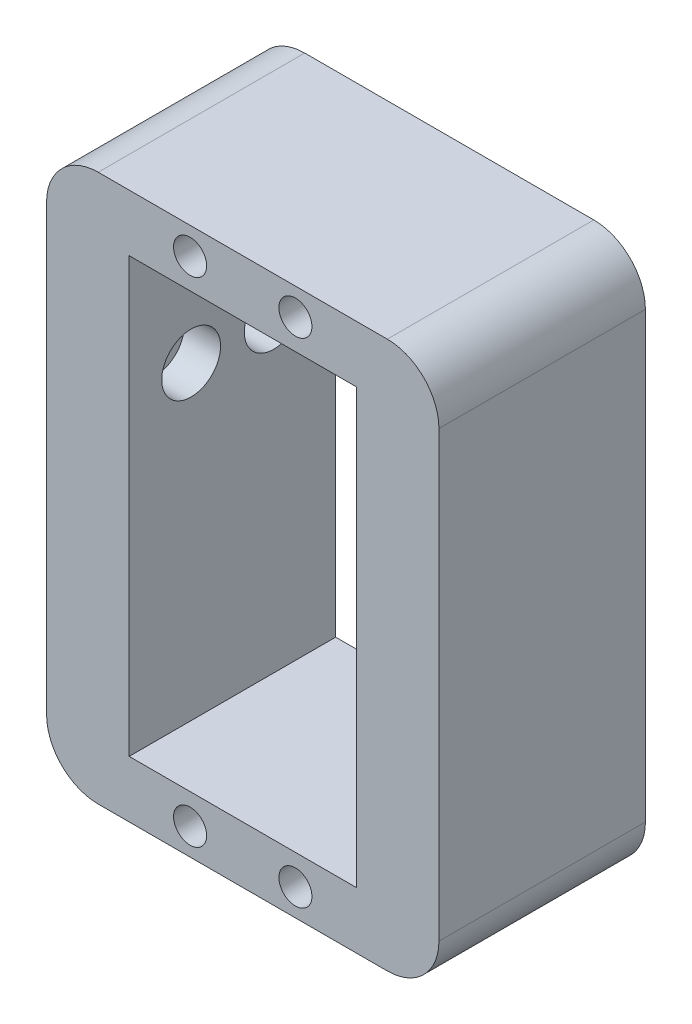
ISO-10303-21;
HEADER;
FILE_DESCRIPTION(('STEP AP214'),'2;1');
FILE_NAME('part.step','',(''),(''),'','','');
FILE_SCHEMA(('AUTOMOTIVE_DESIGN { 1 0 10303 214 1 1 1 1 }'));
ENDSEC;
DATA;
#1=APPLICATION_CONTEXT('core data for automotive mechanical design processes');
#2=APPLICATION_PROTOCOL_DEFINITION('international standard','automotive_design',2000,#1);
#3=PRODUCT_CONTEXT('',#1,'mechanical');
#4=PRODUCT('Part','Part','',(#3));
#5=PRODUCT_RELATED_PRODUCT_CATEGORY('part','',(#4));
#6=PRODUCT_DEFINITION_FORMATION('','',#4);
#7=PRODUCT_DEFINITION_CONTEXT('part definition',#1,'design');
#8=PRODUCT_DEFINITION('design','',#6,#7);
#9=PRODUCT_DEFINITION_SHAPE('','',#8);
#10=(LENGTH_UNIT() NAMED_UNIT(*) SI_UNIT(.MILLI.,.METRE.));
#11=(NAMED_UNIT(*) PLANE_ANGLE_UNIT() SI_UNIT($,.RADIAN.));
#12=(NAMED_UNIT(*) SI_UNIT($,.STERADIAN.) SOLID_ANGLE_UNIT());
#13=UNCERTAINTY_MEASURE_WITH_UNIT(LENGTH_MEASURE(1.E-05),#10,'distance_accuracy_value','');
#14=(GEOMETRIC_REPRESENTATION_CONTEXT(3) GLOBAL_UNCERTAINTY_ASSIGNED_CONTEXT((#13)) GLOBAL_UNIT_ASSIGNED_CONTEXT((#10,
#11,#12)) REPRESENTATION_CONTEXT('',''));
#15=CARTESIAN_POINT('',(0.,0.,0.));
#16=DIRECTION('',(0.,0.,1.));
#17=DIRECTION('',(1.,0.,0.));
#18=AXIS2_PLACEMENT_3D('',#15,#16,#17);
#19=CARTESIAN_POINT('',(-19.,9.00000000000001,6.));
#20=DIRECTION('',(1.,0.,0.));
#21=DIRECTION('',(0.,0.,-1.));
#22=AXIS2_PLACEMENT_3D('',#19,#20,#21);
#23=CYLINDRICAL_SURFACE('',#22,1.75);
#24=CARTESIAN_POINT('',(-19.,9.00000000000001,6.));
#25=DIRECTION('',(1.,0.,0.));
#26=DIRECTION('',(0.,0.,-1.));
#27=AXIS2_PLACEMENT_3D('',#24,#25,#26);
#28=CIRCLE('',#27,1.75);
#29=CARTESIAN_POINT('',(-19.,9.00000000000001,4.25));
#30=VERTEX_POINT('',#29);
#31=EDGE_CURVE('E421',#30,#30,#28,.T.);
#32=ORIENTED_EDGE('',*,*,#31,.F.);
#33=EDGE_LOOP('',(#32));
#34=FACE_BOUND('',#33,.T.);
#35=CARTESIAN_POINT('',(-14.5,9.00000000000001,6.));
#36=DIRECTION('',(1.,0.,0.));
#37=DIRECTION('',(0.,0.,-1.));
#38=AXIS2_PLACEMENT_3D('',#35,#36,#37);
#39=CIRCLE('',#38,1.75);
#40=CARTESIAN_POINT('',(-14.5,9.00000000000001,4.25));
#41=VERTEX_POINT('',#40);
#42=EDGE_CURVE('E402',#41,#41,#39,.T.);
#43=ORIENTED_EDGE('',*,*,#42,.T.);
#44=EDGE_LOOP('',(#43));
#45=FACE_BOUND('',#44,.T.);
#46=ADVANCED_FACE('F37',(#34,#45),#23,.F.);
#47=CARTESIAN_POINT('',(-19.,9.00000000000001,14.));
#48=DIRECTION('',(1.,0.,0.));
#49=DIRECTION('',(0.,0.,-1.));
#50=AXIS2_PLACEMENT_3D('',#47,#48,#49);
#51=CYLINDRICAL_SURFACE('',#50,1.75);
#52=CARTESIAN_POINT('',(-19.,9.00000000000001,14.));
#53=DIRECTION('',(1.,0.,0.));
#54=DIRECTION('',(0.,0.,-1.));
#55=AXIS2_PLACEMENT_3D('',#52,#53,#54);
#56=CIRCLE('',#55,1.75);
#57=CARTESIAN_POINT('',(-19.,9.00000000000001,12.25));
#58=VERTEX_POINT('',#57);
#59=EDGE_CURVE('E417',#58,#58,#56,.T.);
#60=ORIENTED_EDGE('',*,*,#59,.F.);
#61=EDGE_LOOP('',(#60));
#62=FACE_BOUND('',#61,.T.);
#63=CARTESIAN_POINT('',(-14.5,9.00000000000001,14.));
#64=DIRECTION('',(1.,0.,0.));
#65=DIRECTION('',(0.,0.,-1.));
#66=AXIS2_PLACEMENT_3D('',#63,#64,#65);
#67=CIRCLE('',#66,1.75);
#68=CARTESIAN_POINT('',(-14.5,9.00000000000001,12.25));
#69=VERTEX_POINT('',#68);
#70=EDGE_CURVE('E406',#69,#69,#67,.T.);
#71=ORIENTED_EDGE('',*,*,#70,.T.);
#72=EDGE_LOOP('',(#71));
#73=FACE_BOUND('',#72,.T.);
#74=ADVANCED_FACE('F265',(#62,#73),#51,.F.);
#75=CARTESIAN_POINT('',(0.,0.,20.));
#76=DIRECTION('',(0.,0.,1.));
#77=DIRECTION('',(1.,0.,0.));
#78=AXIS2_PLACEMENT_3D('',#75,#76,#77);
#79=PLANE('',#78);
#80=CARTESIAN_POINT('',(-5.1,-23.8999999999999,20.));
#81=DIRECTION('',(0.,0.,-1.));
#82=DIRECTION('',(-1.,0.,0.));
#83=AXIS2_PLACEMENT_3D('',#80,#81,#82);
#84=CIRCLE('',#83,1.6);
#85=CARTESIAN_POINT('',(-6.7,-23.8999999999999,20.));
#86=VERTEX_POINT('',#85);
#87=EDGE_CURVE('E431',#86,#86,#84,.T.);
#88=ORIENTED_EDGE('',*,*,#87,.T.);
#89=EDGE_LOOP('',(#88));
#90=FACE_BOUND('',#89,.T.);
#91=CARTESIAN_POINT('',(5.1,23.9000000000001,20.));
#92=DIRECTION('',(0.,0.,-1.));
#93=DIRECTION('',(-1.,0.,0.));
#94=AXIS2_PLACEMENT_3D('',#91,#92,#93);
#95=CIRCLE('',#94,1.6);
#96=CARTESIAN_POINT('',(3.5,23.9000000000001,20.));
#97=VERTEX_POINT('',#96);
#98=EDGE_CURVE('E438',#97,#97,#95,.T.);
#99=ORIENTED_EDGE('',*,*,#98,.T.);
#100=EDGE_LOOP('',(#99));
#101=FACE_BOUND('',#100,.T.);
#102=CARTESIAN_POINT('',(-5.1,23.9000000000001,20.));
#103=DIRECTION('',(0.,0.,-1.));
#104=DIRECTION('',(-1.,0.,0.));
#105=AXIS2_PLACEMENT_3D('',#102,#103,#104);
#106=CIRCLE('',#105,1.6);
#107=CARTESIAN_POINT('',(-6.7,23.9000000000001,20.));
#108=VERTEX_POINT('',#107);
#109=EDGE_CURVE('E425',#108,#108,#106,.T.);
#110=ORIENTED_EDGE('',*,*,#109,.T.);
#111=EDGE_LOOP('',(#110));
#112=FACE_BOUND('',#111,.T.);
#113=CARTESIAN_POINT('',(5.1,-23.8999999999999,20.));
#114=DIRECTION('',(0.,0.,-1.));
#115=DIRECTION('',(-1.,0.,0.));
#116=AXIS2_PLACEMENT_3D('',#113,#114,#115);
#117=CIRCLE('',#116,1.6);
#118=CARTESIAN_POINT('',(3.5,-23.8999999999999,20.));
#119=VERTEX_POINT('',#118);
#120=EDGE_CURVE('E160',#119,#119,#117,.T.);
#121=ORIENTED_EDGE('',*,*,#120,.T.);
#122=EDGE_LOOP('',(#121));
#123=FACE_BOUND('',#122,.T.);
#124=DIRECTION('',(0.,-1.,0.));
#125=VECTOR('',#124,1.);
#126=CARTESIAN_POINT('',(-19.,26.5,20.));
#127=LINE('',#126,#125);
#128=CARTESIAN_POINT('',(-19.,21.5,20.));
#129=VERTEX_POINT('',#128);
#130=CARTESIAN_POINT('',(-19.,-21.5,20.));
#131=VERTEX_POINT('',#130);
#132=EDGE_CURVE('E176',#129,#131,#127,.T.);
#133=ORIENTED_EDGE('',*,*,#132,.T.);
#134=CARTESIAN_POINT('',(-14.,-21.5,20.));
#135=DIRECTION('',(0.,0.,1.));
#136=DIRECTION('',(1.,0.,0.));
#137=AXIS2_PLACEMENT_3D('',#134,#135,#136);
#138=CIRCLE('',#137,5.);
#139=CARTESIAN_POINT('',(-14.,-26.5,20.));
#140=VERTEX_POINT('',#139);
#141=EDGE_CURVE('E214',#131,#140,#138,.T.);
#142=ORIENTED_EDGE('',*,*,#141,.T.);
#143=DIRECTION('',(1.,0.,0.));
#144=VECTOR('',#143,1.);
#145=CARTESIAN_POINT('',(-19.,-26.5,20.));
#146=LINE('',#145,#144);
#147=CARTESIAN_POINT('',(14.,-26.5,20.));
#148=VERTEX_POINT('',#147);
#149=EDGE_CURVE('E179',#140,#148,#146,.T.);
#150=ORIENTED_EDGE('',*,*,#149,.T.);
#151=CARTESIAN_POINT('',(14.,-21.5,20.));
#152=DIRECTION('',(0.,0.,1.));
#153=DIRECTION('',(1.,0.,0.));
#154=AXIS2_PLACEMENT_3D('',#151,#152,#153);
#155=CIRCLE('',#154,5.);
#156=CARTESIAN_POINT('',(19.,-21.5,20.));
#157=VERTEX_POINT('',#156);
#158=EDGE_CURVE('E212',#148,#157,#155,.T.);
#159=ORIENTED_EDGE('',*,*,#158,.T.);
#160=DIRECTION('',(0.,1.,0.));
#161=VECTOR('',#160,1.);
#162=CARTESIAN_POINT('',(19.,26.5,20.));
#163=LINE('',#162,#161);
#164=CARTESIAN_POINT('',(19.,21.5,20.));
#165=VERTEX_POINT('',#164);
#166=EDGE_CURVE('E171',#157,#165,#163,.T.);
#167=ORIENTED_EDGE('',*,*,#166,.T.);
#168=CARTESIAN_POINT('',(14.,21.5,20.));
#169=DIRECTION('',(0.,0.,1.));
#170=DIRECTION('',(1.,0.,0.));
#171=AXIS2_PLACEMENT_3D('',#168,#169,#170);
#172=CIRCLE('',#171,5.);
#173=CARTESIAN_POINT('',(14.,26.5,20.));
#174=VERTEX_POINT('',#173);
#175=EDGE_CURVE('E57',#165,#174,#172,.T.);
#176=ORIENTED_EDGE('',*,*,#175,.T.);
#177=DIRECTION('',(-1.,0.,0.));
#178=VECTOR('',#177,1.);
#179=CARTESIAN_POINT('',(-19.,26.5,20.));
#180=LINE('',#179,#178);
#181=CARTESIAN_POINT('',(-14.,26.5,20.));
#182=VERTEX_POINT('',#181);
#183=EDGE_CURVE('E173',#174,#182,#180,.T.);
#184=ORIENTED_EDGE('',*,*,#183,.T.);
#185=CARTESIAN_POINT('',(-14.,21.5,20.));
#186=DIRECTION('',(0.,0.,1.));
#187=DIRECTION('',(1.,0.,0.));
#188=AXIS2_PLACEMENT_3D('',#185,#186,#187);
#189=CIRCLE('',#188,5.);
#190=EDGE_CURVE('E210',#182,#129,#189,.T.);
#191=ORIENTED_EDGE('',*,*,#190,.T.);
#192=EDGE_LOOP('',(#133,#142,#150,#159,#167,#176,#184,#191));
#193=FACE_BOUND('',#192,.T.);
#194=DIRECTION('',(-1.,0.,0.));
#195=VECTOR('',#194,1.);
#196=CARTESIAN_POINT('',(-11.,21.,20.));
#197=LINE('',#196,#195);
#198=CARTESIAN_POINT('',(11.,21.,20.));
#199=VERTEX_POINT('',#198);
#200=CARTESIAN_POINT('',(-11.,21.,20.));
#201=VERTEX_POINT('',#200);
#202=EDGE_CURVE('E137',#199,#201,#197,.T.);
#203=ORIENTED_EDGE('',*,*,#202,.F.);
#204=DIRECTION('',(0.,1.,0.));
#205=VECTOR('',#204,1.);
#206=CARTESIAN_POINT('',(11.,21.,20.));
#207=LINE('',#206,#205);
#208=CARTESIAN_POINT('',(11.,-21.,20.));
#209=VERTEX_POINT('',#208);
#210=EDGE_CURVE('E127',#209,#199,#207,.T.);
#211=ORIENTED_EDGE('',*,*,#210,.F.);
#212=DIRECTION('',(1.,0.,0.));
#213=VECTOR('',#212,1.);
#214=CARTESIAN_POINT('',(-11.,-21.,20.));
#215=LINE('',#214,#213);
#216=CARTESIAN_POINT('',(-11.,-21.,20.));
#217=VERTEX_POINT('',#216);
#218=EDGE_CURVE('E153',#217,#209,#215,.T.);
#219=ORIENTED_EDGE('',*,*,#218,.F.);
#220=DIRECTION('',(0.,-1.,0.));
#221=VECTOR('',#220,1.);
#222=CARTESIAN_POINT('',(-11.,21.,20.));
#223=LINE('',#222,#221);
#224=EDGE_CURVE('E151',#201,#217,#223,.T.);
#225=ORIENTED_EDGE('',*,*,#224,.F.);
#226=EDGE_LOOP('',(#203,#211,#219,#225));
#227=FACE_BOUND('',#226,.T.);
#228=ADVANCED_FACE('F149',(#90,#101,#112,#123,#193,#227),#79,.T.);
#229=CARTESIAN_POINT('',(0.,0.,0.));
#230=DIRECTION('',(0.,0.,1.));
#231=DIRECTION('',(1.,0.,0.));
#232=AXIS2_PLACEMENT_3D('',#229,#230,#231);
#233=PLANE('',#232);
#234=CARTESIAN_POINT('',(-5.1,-23.8999999999999,0.));
#235=DIRECTION('',(0.,0.,-1.));
#236=DIRECTION('',(-1.,0.,0.));
#237=AXIS2_PLACEMENT_3D('',#234,#235,#236);
#238=CIRCLE('',#237,1.6);
#239=CARTESIAN_POINT('',(-6.7,-23.8999999999999,0.));
#240=VERTEX_POINT('',#239);
#241=EDGE_CURVE('E435',#240,#240,#238,.T.);
#242=ORIENTED_EDGE('',*,*,#241,.F.);
#243=EDGE_LOOP('',(#242));
#244=FACE_BOUND('',#243,.T.);
#245=CARTESIAN_POINT('',(5.1,23.9000000000001,0.));
#246=DIRECTION('',(0.,0.,-1.));
#247=DIRECTION('',(-1.,0.,0.));
#248=AXIS2_PLACEMENT_3D('',#245,#246,#247);
#249=CIRCLE('',#248,1.6);
#250=CARTESIAN_POINT('',(3.5,23.9000000000001,0.));
#251=VERTEX_POINT('',#250);
#252=EDGE_CURVE('E428',#251,#251,#249,.T.);
#253=ORIENTED_EDGE('',*,*,#252,.F.);
#254=EDGE_LOOP('',(#253));
#255=FACE_BOUND('',#254,.T.);
#256=CARTESIAN_POINT('',(-5.1,23.9000000000001,0.));
#257=DIRECTION('',(0.,0.,-1.));
#258=DIRECTION('',(-1.,0.,0.));
#259=AXIS2_PLACEMENT_3D('',#256,#257,#258);
#260=CIRCLE('',#259,1.6);
#261=CARTESIAN_POINT('',(-6.7,23.9000000000001,0.));
#262=VERTEX_POINT('',#261);
#263=EDGE_CURVE('E420',#262,#262,#260,.T.);
#264=ORIENTED_EDGE('',*,*,#263,.F.);
#265=EDGE_LOOP('',(#264));
#266=FACE_BOUND('',#265,.T.);
#267=CARTESIAN_POINT('',(5.1,-23.8999999999999,0.));
#268=DIRECTION('',(0.,0.,-1.));
#269=DIRECTION('',(-1.,0.,0.));
#270=AXIS2_PLACEMENT_3D('',#267,#268,#269);
#271=CIRCLE('',#270,1.6);
#272=CARTESIAN_POINT('',(3.5,-23.8999999999999,0.));
#273=VERTEX_POINT('',#272);
#274=EDGE_CURVE('E434',#273,#273,#271,.T.);
#275=ORIENTED_EDGE('',*,*,#274,.F.);
#276=EDGE_LOOP('',(#275));
#277=FACE_BOUND('',#276,.T.);
#278=DIRECTION('',(1.,0.,0.));
#279=VECTOR('',#278,1.);
#280=CARTESIAN_POINT('',(-19.,-26.5,0.));
#281=LINE('',#280,#279);
#282=CARTESIAN_POINT('',(-14.,-26.5,0.));
#283=VERTEX_POINT('',#282);
#284=CARTESIAN_POINT('',(14.,-26.5,0.));
#285=VERTEX_POINT('',#284);
#286=EDGE_CURVE('E174',#283,#285,#281,.T.);
#287=ORIENTED_EDGE('',*,*,#286,.F.);
#288=CARTESIAN_POINT('',(-14.,-21.5,0.));
#289=DIRECTION('',(0.,0.,1.));
#290=DIRECTION('',(1.,0.,0.));
#291=AXIS2_PLACEMENT_3D('',#288,#289,#290);
#292=CIRCLE('',#291,5.);
#293=CARTESIAN_POINT('',(-19.,-21.5,0.));
#294=VERTEX_POINT('',#293);
#295=EDGE_CURVE('E202',#283,#294,#292,.F.);
#296=ORIENTED_EDGE('',*,*,#295,.T.);
#297=DIRECTION('',(0.,-1.,0.));
#298=VECTOR('',#297,1.);
#299=CARTESIAN_POINT('',(-19.,26.5,0.));
#300=LINE('',#299,#298);
#301=CARTESIAN_POINT('',(-19.,21.5,0.));
#302=VERTEX_POINT('',#301);
#303=EDGE_CURVE('E187',#302,#294,#300,.T.);
#304=ORIENTED_EDGE('',*,*,#303,.F.);
#305=CARTESIAN_POINT('',(-14.,21.5,0.));
#306=DIRECTION('',(0.,0.,1.));
#307=DIRECTION('',(1.,0.,0.));
#308=AXIS2_PLACEMENT_3D('',#305,#306,#307);
#309=CIRCLE('',#308,5.);
#310=CARTESIAN_POINT('',(-14.,26.5,0.));
#311=VERTEX_POINT('',#310);
#312=EDGE_CURVE('E198',#302,#311,#309,.F.);
#313=ORIENTED_EDGE('',*,*,#312,.T.);
#314=DIRECTION('',(-1.,0.,0.));
#315=VECTOR('',#314,1.);
#316=CARTESIAN_POINT('',(-19.,26.5,0.));
#317=LINE('',#316,#315);
#318=CARTESIAN_POINT('',(14.,26.5,0.));
#319=VERTEX_POINT('',#318);
#320=EDGE_CURVE('E185',#319,#311,#317,.T.);
#321=ORIENTED_EDGE('',*,*,#320,.F.);
#322=CARTESIAN_POINT('',(14.,21.5,0.));
#323=DIRECTION('',(0.,0.,1.));
#324=DIRECTION('',(1.,0.,0.));
#325=AXIS2_PLACEMENT_3D('',#322,#323,#324);
#326=CIRCLE('',#325,5.);
#327=CARTESIAN_POINT('',(19.,21.5,0.));
#328=VERTEX_POINT('',#327);
#329=EDGE_CURVE('E196',#319,#328,#326,.F.);
#330=ORIENTED_EDGE('',*,*,#329,.T.);
#331=DIRECTION('',(0.,1.,0.));
#332=VECTOR('',#331,1.);
#333=CARTESIAN_POINT('',(19.,26.5,0.));
#334=LINE('',#333,#332);
#335=CARTESIAN_POINT('',(19.,-21.5,0.));
#336=VERTEX_POINT('',#335);
#337=EDGE_CURVE('E145',#336,#328,#334,.T.);
#338=ORIENTED_EDGE('',*,*,#337,.F.);
#339=CARTESIAN_POINT('',(14.,-21.5,0.));
#340=DIRECTION('',(0.,0.,1.));
#341=DIRECTION('',(1.,0.,0.));
#342=AXIS2_PLACEMENT_3D('',#339,#340,#341);
#343=CIRCLE('',#342,5.);
#344=EDGE_CURVE('E200',#336,#285,#343,.F.);
#345=ORIENTED_EDGE('',*,*,#344,.T.);
#346=EDGE_LOOP('',(#287,#296,#304,#313,#321,#330,#338,#345));
#347=FACE_BOUND('',#346,.T.);
#348=DIRECTION('',(0.,1.,0.));
#349=VECTOR('',#348,1.);
#350=CARTESIAN_POINT('',(11.,21.,0.));
#351=LINE('',#350,#349);
#352=CARTESIAN_POINT('',(11.,-21.,0.));
#353=VERTEX_POINT('',#352);
#354=CARTESIAN_POINT('',(11.,21.,0.));
#355=VERTEX_POINT('',#354);
#356=EDGE_CURVE('E158',#353,#355,#351,.T.);
#357=ORIENTED_EDGE('',*,*,#356,.T.);
#358=DIRECTION('',(-1.,0.,0.));
#359=VECTOR('',#358,1.);
#360=CARTESIAN_POINT('',(-11.,21.,0.));
#361=LINE('',#360,#359);
#362=CARTESIAN_POINT('',(-11.,21.,0.));
#363=VERTEX_POINT('',#362);
#364=EDGE_CURVE('E144',#355,#363,#361,.T.);
#365=ORIENTED_EDGE('',*,*,#364,.T.);
#366=DIRECTION('',(0.,-1.,0.));
#367=VECTOR('',#366,1.);
#368=CARTESIAN_POINT('',(-11.,21.,0.));
#369=LINE('',#368,#367);
#370=CARTESIAN_POINT('',(-11.,-21.,0.));
#371=VERTEX_POINT('',#370);
#372=EDGE_CURVE('E162',#363,#371,#369,.T.);
#373=ORIENTED_EDGE('',*,*,#372,.T.);
#374=DIRECTION('',(1.,0.,0.));
#375=VECTOR('',#374,1.);
#376=CARTESIAN_POINT('',(-11.,-21.,0.));
#377=LINE('',#376,#375);
#378=EDGE_CURVE('E138',#371,#353,#377,.T.);
#379=ORIENTED_EDGE('',*,*,#378,.T.);
#380=EDGE_LOOP('',(#357,#365,#373,#379));
#381=FACE_BOUND('',#380,.T.);
#382=ADVANCED_FACE('F227',(#244,#255,#266,#277,#347,#381),#233,.F.);
#383=CARTESIAN_POINT('',(19.,26.5,20.));
#384=DIRECTION('',(-1.,0.,0.));
#385=DIRECTION('',(0.,0.,1.));
#386=AXIS2_PLACEMENT_3D('',#383,#384,#385);
#387=PLANE('',#386);
#388=ORIENTED_EDGE('',*,*,#166,.F.);
#389=DIRECTION('',(0.,0.,-1.));
#390=VECTOR('',#389,1.);
#391=CARTESIAN_POINT('',(19.,-21.5,20.));
#392=LINE('',#391,#390);
#393=EDGE_CURVE('E218',#157,#336,#392,.T.);
#394=ORIENTED_EDGE('',*,*,#393,.T.);
#395=ORIENTED_EDGE('',*,*,#337,.T.);
#396=DIRECTION('',(0.,0.,-1.));
#397=VECTOR('',#396,1.);
#398=CARTESIAN_POINT('',(19.,21.5,20.));
#399=LINE('',#398,#397);
#400=EDGE_CURVE('E216',#328,#165,#399,.F.);
#401=ORIENTED_EDGE('',*,*,#400,.T.);
#402=EDGE_LOOP('',(#388,#394,#395,#401));
#403=FACE_BOUND('',#402,.T.);
#404=ADVANCED_FACE('F253',(#403),#387,.F.);
#405=CARTESIAN_POINT('',(-19.,26.5,20.));
#406=DIRECTION('',(0.,-1.,0.));
#407=DIRECTION('',(0.,0.,-1.));
#408=AXIS2_PLACEMENT_3D('',#405,#406,#407);
#409=PLANE('',#408);
#410=ORIENTED_EDGE('',*,*,#320,.T.);
#411=DIRECTION('',(0.,0.,-1.));
#412=VECTOR('',#411,1.);
#413=CARTESIAN_POINT('',(-14.,26.5,20.));
#414=LINE('',#413,#412);
#415=EDGE_CURVE('E11',#311,#182,#414,.F.);
#416=ORIENTED_EDGE('',*,*,#415,.T.);
#417=ORIENTED_EDGE('',*,*,#183,.F.);
#418=DIRECTION('',(0.,0.,-1.));
#419=VECTOR('',#418,1.);
#420=CARTESIAN_POINT('',(14.,26.5,20.));
#421=LINE('',#420,#419);
#422=EDGE_CURVE('E45',#174,#319,#421,.T.);
#423=ORIENTED_EDGE('',*,*,#422,.T.);
#424=EDGE_LOOP('',(#410,#416,#417,#423));
#425=FACE_BOUND('',#424,.T.);
#426=ADVANCED_FACE('F223',(#425),#409,.F.);
#427=CARTESIAN_POINT('',(-19.,26.5,20.));
#428=DIRECTION('',(1.,0.,0.));
#429=DIRECTION('',(0.,0.,-1.));
#430=AXIS2_PLACEMENT_3D('',#427,#428,#429);
#431=PLANE('',#430);
#432=ORIENTED_EDGE('',*,*,#59,.T.);
#433=EDGE_LOOP('',(#432));
#434=FACE_BOUND('',#433,.T.);
#435=ORIENTED_EDGE('',*,*,#31,.T.);
#436=EDGE_LOOP('',(#435));
#437=FACE_BOUND('',#436,.T.);
#438=ORIENTED_EDGE('',*,*,#303,.T.);
#439=DIRECTION('',(0.,0.,-1.));
#440=VECTOR('',#439,1.);
#441=CARTESIAN_POINT('',(-19.,-21.5,20.));
#442=LINE('',#441,#440);
#443=EDGE_CURVE('E207',#294,#131,#442,.F.);
#444=ORIENTED_EDGE('',*,*,#443,.T.);
#445=ORIENTED_EDGE('',*,*,#132,.F.);
#446=DIRECTION('',(0.,0.,-1.));
#447=VECTOR('',#446,1.);
#448=CARTESIAN_POINT('',(-19.,21.5,20.));
#449=LINE('',#448,#447);
#450=EDGE_CURVE('E204',#129,#302,#449,.T.);
#451=ORIENTED_EDGE('',*,*,#450,.T.);
#452=EDGE_LOOP('',(#438,#444,#445,#451));
#453=FACE_BOUND('',#452,.T.);
#454=ADVANCED_FACE('F237',(#434,#437,#453),#431,.F.);
#455=CARTESIAN_POINT('',(-19.,-26.5,20.));
#456=DIRECTION('',(0.,1.,0.));
#457=DIRECTION('',(0.,0.,1.));
#458=AXIS2_PLACEMENT_3D('',#455,#456,#457);
#459=PLANE('',#458);
#460=ORIENTED_EDGE('',*,*,#149,.F.);
#461=DIRECTION('',(0.,0.,-1.));
#462=VECTOR('',#461,1.);
#463=CARTESIAN_POINT('',(-14.,-26.5,20.));
#464=LINE('',#463,#462);
#465=EDGE_CURVE('E193',#140,#283,#464,.T.);
#466=ORIENTED_EDGE('',*,*,#465,.T.);
#467=ORIENTED_EDGE('',*,*,#286,.T.);
#468=DIRECTION('',(0.,0.,-1.));
#469=VECTOR('',#468,1.);
#470=CARTESIAN_POINT('',(14.,-26.5,20.));
#471=LINE('',#470,#469);
#472=EDGE_CURVE('E182',#285,#148,#471,.F.);
#473=ORIENTED_EDGE('',*,*,#472,.T.);
#474=EDGE_LOOP('',(#460,#466,#467,#473));
#475=FACE_BOUND('',#474,.T.);
#476=ADVANCED_FACE('F245',(#475),#459,.F.);
#477=CARTESIAN_POINT('',(11.,21.,20.));
#478=DIRECTION('',(-1.,0.,0.));
#479=DIRECTION('',(0.,-1.,0.));
#480=AXIS2_PLACEMENT_3D('',#477,#478,#479);
#481=PLANE('',#480);
#482=ORIENTED_EDGE('',*,*,#356,.F.);
#483=DIRECTION('',(0.,0.,-1.));
#484=VECTOR('',#483,1.);
#485=CARTESIAN_POINT('',(11.,-21.,20.));
#486=LINE('',#485,#484);
#487=EDGE_CURVE('E133',#209,#353,#486,.T.);
#488=ORIENTED_EDGE('',*,*,#487,.F.);
#489=ORIENTED_EDGE('',*,*,#210,.T.);
#490=DIRECTION('',(0.,0.,-1.));
#491=VECTOR('',#490,1.);
#492=CARTESIAN_POINT('',(11.,21.,20.));
#493=LINE('',#492,#491);
#494=EDGE_CURVE('E130',#199,#355,#493,.T.);
#495=ORIENTED_EDGE('',*,*,#494,.T.);
#496=EDGE_LOOP('',(#482,#488,#489,#495));
#497=FACE_BOUND('',#496,.T.);
#498=ADVANCED_FACE('F129',(#497),#481,.T.);
#499=CARTESIAN_POINT('',(-11.,21.,20.));
#500=DIRECTION('',(0.,-1.,0.));
#501=DIRECTION('',(0.,0.,-1.));
#502=AXIS2_PLACEMENT_3D('',#499,#500,#501);
#503=PLANE('',#502);
#504=ORIENTED_EDGE('',*,*,#364,.F.);
#505=ORIENTED_EDGE('',*,*,#494,.F.);
#506=ORIENTED_EDGE('',*,*,#202,.T.);
#507=DIRECTION('',(0.,0.,-1.));
#508=VECTOR('',#507,1.);
#509=CARTESIAN_POINT('',(-11.,21.,20.));
#510=LINE('',#509,#508);
#511=EDGE_CURVE('E146',#201,#363,#510,.T.);
#512=ORIENTED_EDGE('',*,*,#511,.T.);
#513=EDGE_LOOP('',(#504,#505,#506,#512));
#514=FACE_BOUND('',#513,.T.);
#515=ADVANCED_FACE('F141',(#514),#503,.T.);
#516=CARTESIAN_POINT('',(-11.,21.,20.));
#517=DIRECTION('',(1.,0.,0.));
#518=DIRECTION('',(0.,0.,-1.));
#519=AXIS2_PLACEMENT_3D('',#516,#517,#518);
#520=PLANE('',#519);
#521=CARTESIAN_POINT('',(-11.,9.00000000000001,14.));
#522=DIRECTION('',(1.,0.,0.));
#523=DIRECTION('',(0.,0.,-1.));
#524=AXIS2_PLACEMENT_3D('',#521,#522,#523);
#525=CIRCLE('',#524,2.85);
#526=CARTESIAN_POINT('',(-11.,9.00000000000001,11.15));
#527=VERTEX_POINT('',#526);
#528=EDGE_CURVE('E410',#527,#527,#525,.T.);
#529=ORIENTED_EDGE('',*,*,#528,.F.);
#530=EDGE_LOOP('',(#529));
#531=FACE_BOUND('',#530,.T.);
#532=CARTESIAN_POINT('',(-11.,9.00000000000001,6.));
#533=DIRECTION('',(1.,0.,0.));
#534=DIRECTION('',(0.,0.,-1.));
#535=AXIS2_PLACEMENT_3D('',#532,#533,#534);
#536=CIRCLE('',#535,2.85);
#537=CARTESIAN_POINT('',(-11.,9.00000000000001,3.15));
#538=VERTEX_POINT('',#537);
#539=EDGE_CURVE('E407',#538,#538,#536,.T.);
#540=ORIENTED_EDGE('',*,*,#539,.F.);
#541=EDGE_LOOP('',(#540));
#542=FACE_BOUND('',#541,.T.);
#543=ORIENTED_EDGE('',*,*,#372,.F.);
#544=ORIENTED_EDGE('',*,*,#511,.F.);
#545=ORIENTED_EDGE('',*,*,#224,.T.);
#546=DIRECTION('',(0.,0.,-1.));
#547=VECTOR('',#546,1.);
#548=CARTESIAN_POINT('',(-11.,-21.,20.));
#549=LINE('',#548,#547);
#550=EDGE_CURVE('E168',#217,#371,#549,.T.);
#551=ORIENTED_EDGE('',*,*,#550,.T.);
#552=EDGE_LOOP('',(#543,#544,#545,#551));
#553=FACE_BOUND('',#552,.T.);
#554=ADVANCED_FACE('F296',(#531,#542,#553),#520,.T.);
#555=CARTESIAN_POINT('',(-11.,-21.,20.));
#556=DIRECTION('',(0.,1.,0.));
#557=DIRECTION('',(0.,0.,1.));
#558=AXIS2_PLACEMENT_3D('',#555,#556,#557);
#559=PLANE('',#558);
#560=ORIENTED_EDGE('',*,*,#378,.F.);
#561=ORIENTED_EDGE('',*,*,#550,.F.);
#562=ORIENTED_EDGE('',*,*,#218,.T.);
#563=ORIENTED_EDGE('',*,*,#487,.T.);
#564=EDGE_LOOP('',(#560,#561,#562,#563));
#565=FACE_BOUND('',#564,.T.);
#566=ADVANCED_FACE('F292',(#565),#559,.T.);
#567=CARTESIAN_POINT('',(5.1,-23.8999999999999,20.));
#568=DIRECTION('',(0.,0.,-1.));
#569=DIRECTION('',(-1.,0.,0.));
#570=AXIS2_PLACEMENT_3D('',#567,#568,#569);
#571=CYLINDRICAL_SURFACE('',#570,1.6);
#572=ORIENTED_EDGE('',*,*,#120,.F.);
#573=EDGE_LOOP('',(#572));
#574=FACE_BOUND('',#573,.T.);
#575=ORIENTED_EDGE('',*,*,#274,.T.);
#576=EDGE_LOOP('',(#575));
#577=FACE_BOUND('',#576,.T.);
#578=ADVANCED_FACE('F281',(#574,#577),#571,.F.);
#579=CARTESIAN_POINT('',(-5.1,23.9000000000001,20.));
#580=DIRECTION('',(0.,0.,-1.));
#581=DIRECTION('',(-1.,0.,0.));
#582=AXIS2_PLACEMENT_3D('',#579,#580,#581);
#583=CYLINDRICAL_SURFACE('',#582,1.6);
#584=ORIENTED_EDGE('',*,*,#109,.F.);
#585=EDGE_LOOP('',(#584));
#586=FACE_BOUND('',#585,.T.);
#587=ORIENTED_EDGE('',*,*,#263,.T.);
#588=EDGE_LOOP('',(#587));
#589=FACE_BOUND('',#588,.T.);
#590=ADVANCED_FACE('F277',(#586,#589),#583,.F.);
#591=CARTESIAN_POINT('',(5.1,23.9000000000001,20.));
#592=DIRECTION('',(0.,0.,-1.));
#593=DIRECTION('',(-1.,0.,0.));
#594=AXIS2_PLACEMENT_3D('',#591,#592,#593);
#595=CYLINDRICAL_SURFACE('',#594,1.6);
#596=ORIENTED_EDGE('',*,*,#98,.F.);
#597=EDGE_LOOP('',(#596));
#598=FACE_BOUND('',#597,.T.);
#599=ORIENTED_EDGE('',*,*,#252,.T.);
#600=EDGE_LOOP('',(#599));
#601=FACE_BOUND('',#600,.T.);
#602=ADVANCED_FACE('F280',(#598,#601),#595,.F.);
#603=CARTESIAN_POINT('',(-5.1,-23.8999999999999,20.));
#604=DIRECTION('',(0.,0.,-1.));
#605=DIRECTION('',(-1.,0.,0.));
#606=AXIS2_PLACEMENT_3D('',#603,#604,#605);
#607=CYLINDRICAL_SURFACE('',#606,1.6);
#608=ORIENTED_EDGE('',*,*,#87,.F.);
#609=EDGE_LOOP('',(#608));
#610=FACE_BOUND('',#609,.T.);
#611=ORIENTED_EDGE('',*,*,#241,.T.);
#612=EDGE_LOOP('',(#611));
#613=FACE_BOUND('',#612,.T.);
#614=ADVANCED_FACE('F283',(#610,#613),#607,.F.);
#615=CARTESIAN_POINT('',(-14.,-21.5,20.));
#616=DIRECTION('',(0.,0.,-1.));
#617=DIRECTION('',(-1.,0.,0.));
#618=AXIS2_PLACEMENT_3D('',#615,#616,#617);
#619=CYLINDRICAL_SURFACE('',#618,5.);
#620=ORIENTED_EDGE('',*,*,#141,.F.);
#621=ORIENTED_EDGE('',*,*,#443,.F.);
#622=ORIENTED_EDGE('',*,*,#295,.F.);
#623=ORIENTED_EDGE('',*,*,#465,.F.);
#624=EDGE_LOOP('',(#620,#621,#622,#623));
#625=FACE_BOUND('',#624,.T.);
#626=ADVANCED_FACE('F243',(#625),#619,.T.);
#627=CARTESIAN_POINT('',(14.,-21.5,20.));
#628=DIRECTION('',(0.,0.,-1.));
#629=DIRECTION('',(-1.,0.,0.));
#630=AXIS2_PLACEMENT_3D('',#627,#628,#629);
#631=CYLINDRICAL_SURFACE('',#630,5.);
#632=ORIENTED_EDGE('',*,*,#158,.F.);
#633=ORIENTED_EDGE('',*,*,#472,.F.);
#634=ORIENTED_EDGE('',*,*,#344,.F.);
#635=ORIENTED_EDGE('',*,*,#393,.F.);
#636=EDGE_LOOP('',(#632,#633,#634,#635));
#637=FACE_BOUND('',#636,.T.);
#638=ADVANCED_FACE('F250',(#637),#631,.T.);
#639=CARTESIAN_POINT('',(-14.,21.5,20.));
#640=DIRECTION('',(0.,0.,-1.));
#641=DIRECTION('',(-1.,0.,0.));
#642=AXIS2_PLACEMENT_3D('',#639,#640,#641);
#643=CYLINDRICAL_SURFACE('',#642,5.);
#644=ORIENTED_EDGE('',*,*,#190,.F.);
#645=ORIENTED_EDGE('',*,*,#415,.F.);
#646=ORIENTED_EDGE('',*,*,#312,.F.);
#647=ORIENTED_EDGE('',*,*,#450,.F.);
#648=EDGE_LOOP('',(#644,#645,#646,#647));
#649=FACE_BOUND('',#648,.T.);
#650=ADVANCED_FACE('F234',(#649),#643,.T.);
#651=CARTESIAN_POINT('',(14.,21.5,20.));
#652=DIRECTION('',(0.,0.,-1.));
#653=DIRECTION('',(-1.,0.,0.));
#654=AXIS2_PLACEMENT_3D('',#651,#652,#653);
#655=CYLINDRICAL_SURFACE('',#654,5.);
#656=ORIENTED_EDGE('',*,*,#175,.F.);
#657=ORIENTED_EDGE('',*,*,#400,.F.);
#658=ORIENTED_EDGE('',*,*,#329,.F.);
#659=ORIENTED_EDGE('',*,*,#422,.F.);
#660=EDGE_LOOP('',(#656,#657,#658,#659));
#661=FACE_BOUND('',#660,.T.);
#662=ADVANCED_FACE('F39',(#661),#655,.T.);
#663=CARTESIAN_POINT('',(-14.5,9.00000000000001,14.));
#664=DIRECTION('',(1.,0.,0.));
#665=DIRECTION('',(0.,0.,-1.));
#666=AXIS2_PLACEMENT_3D('',#663,#664,#665);
#667=CYLINDRICAL_SURFACE('',#666,2.85);
#668=CARTESIAN_POINT('',(-14.5,9.00000000000001,14.));
#669=DIRECTION('',(1.,0.,0.));
#670=DIRECTION('',(0.,0.,-1.));
#671=AXIS2_PLACEMENT_3D('',#668,#669,#670);
#672=CIRCLE('',#671,2.85);
#673=CARTESIAN_POINT('',(-14.5,9.00000000000001,11.15));
#674=VERTEX_POINT('',#673);
#675=EDGE_CURVE('E424',#674,#674,#672,.T.);
#676=ORIENTED_EDGE('',*,*,#675,.F.);
#677=EDGE_LOOP('',(#676));
#678=FACE_BOUND('',#677,.T.);
#679=ORIENTED_EDGE('',*,*,#528,.T.);
#680=EDGE_LOOP('',(#679));
#681=FACE_BOUND('',#680,.T.);
#682=ADVANCED_FACE('F256',(#678,#681),#667,.F.);
#683=CARTESIAN_POINT('',(-14.5,9.00000000000001,14.));
#684=DIRECTION('',(1.,0.,0.));
#685=DIRECTION('',(0.,0.,-1.));
#686=AXIS2_PLACEMENT_3D('',#683,#684,#685);
#687=PLANE('',#686);
#688=ORIENTED_EDGE('',*,*,#70,.F.);
#689=EDGE_LOOP('',(#688));
#690=FACE_BOUND('',#689,.T.);
#691=ORIENTED_EDGE('',*,*,#675,.T.);
#692=EDGE_LOOP('',(#691));
#693=FACE_BOUND('',#692,.T.);
#694=ADVANCED_FACE('F261',(#690,#693),#687,.T.);
#695=CARTESIAN_POINT('',(-14.5,9.00000000000001,6.));
#696=DIRECTION('',(1.,0.,0.));
#697=DIRECTION('',(0.,0.,-1.));
#698=AXIS2_PLACEMENT_3D('',#695,#696,#697);
#699=CYLINDRICAL_SURFACE('',#698,2.85);
#700=CARTESIAN_POINT('',(-14.5,9.00000000000001,6.));
#701=DIRECTION('',(1.,0.,0.));
#702=DIRECTION('',(0.,0.,-1.));
#703=AXIS2_PLACEMENT_3D('',#700,#701,#702);
#704=CIRCLE('',#703,2.85);
#705=CARTESIAN_POINT('',(-14.5,9.00000000000001,3.15));
#706=VERTEX_POINT('',#705);
#707=EDGE_CURVE('E405',#706,#706,#704,.T.);
#708=ORIENTED_EDGE('',*,*,#707,.F.);
#709=EDGE_LOOP('',(#708));
#710=FACE_BOUND('',#709,.T.);
#711=ORIENTED_EDGE('',*,*,#539,.T.);
#712=EDGE_LOOP('',(#711));
#713=FACE_BOUND('',#712,.T.);
#714=ADVANCED_FACE('F376',(#710,#713),#699,.F.);
#715=CARTESIAN_POINT('',(-14.5,9.00000000000001,6.));
#716=DIRECTION('',(1.,0.,0.));
#717=DIRECTION('',(0.,0.,-1.));
#718=AXIS2_PLACEMENT_3D('',#715,#716,#717);
#719=PLANE('',#718);
#720=ORIENTED_EDGE('',*,*,#42,.F.);
#721=EDGE_LOOP('',(#720));
#722=FACE_BOUND('',#721,.T.);
#723=ORIENTED_EDGE('',*,*,#707,.T.);
#724=EDGE_LOOP('',(#723));
#725=FACE_BOUND('',#724,.T.);
#726=ADVANCED_FACE('F386',(#722,#725),#719,.T.);
#727=CLOSED_SHELL('',(#46,#74,#228,#382,#404,#426,#454,#476,#498,#515,#554,#566,#578,#590,#602,
#614,#626,#638,#650,#662,#682,#694,#714,#726));
#728=MANIFOLD_SOLID_BREP('B2',#727);
#729=ADVANCED_BREP_SHAPE_REPRESENTATION('',(#18,#728),#14);
#730=SHAPE_DEFINITION_REPRESENTATION(#9,#729);
ENDSEC;
END-ISO-10303-21;
